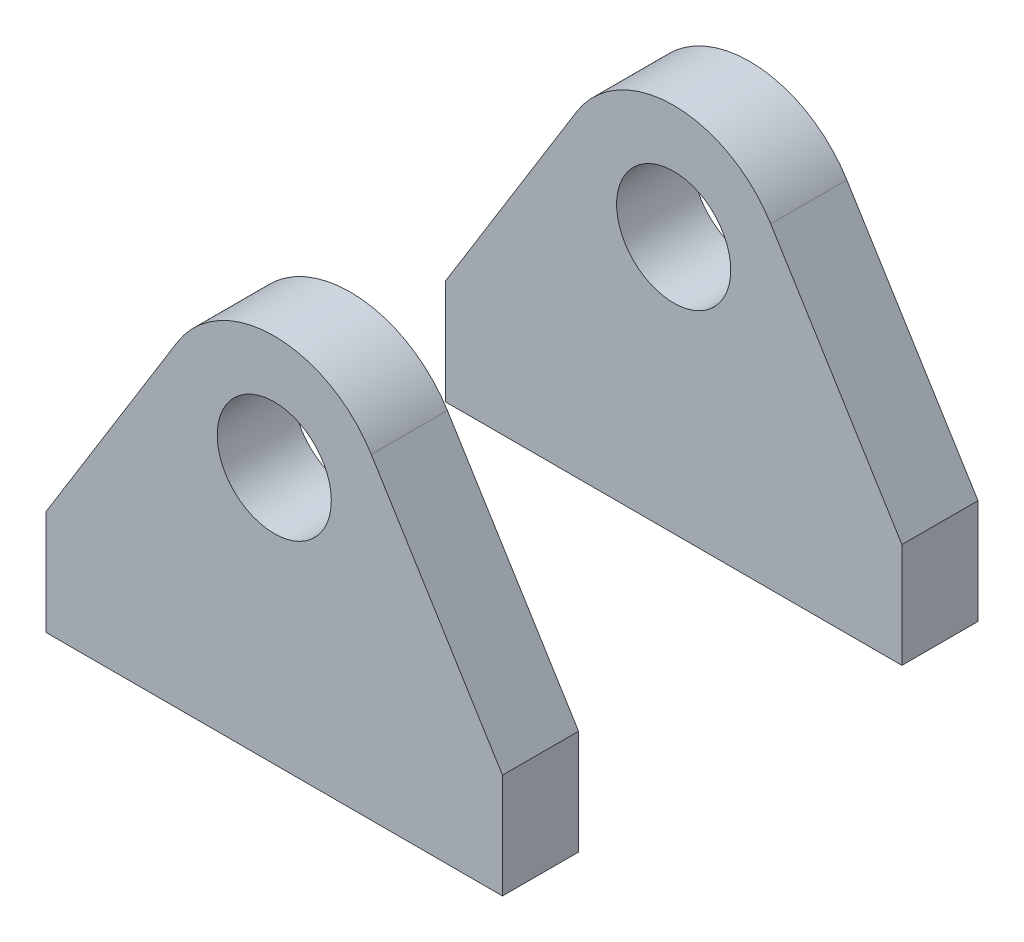
ISO-10303-21;
HEADER;
FILE_DESCRIPTION(('STEP AP214'),'2;1');
FILE_NAME('part.step','',(''),(''),'','','');
FILE_SCHEMA(('AUTOMOTIVE_DESIGN { 1 0 10303 214 1 1 1 1 }'));
ENDSEC;
DATA;
#1=APPLICATION_CONTEXT('core data for automotive mechanical design processes');
#2=APPLICATION_PROTOCOL_DEFINITION('international standard','automotive_design',2000,#1);
#3=PRODUCT_CONTEXT('',#1,'mechanical');
#4=PRODUCT('Part','Part','',(#3));
#5=PRODUCT_RELATED_PRODUCT_CATEGORY('part','',(#4));
#6=PRODUCT_DEFINITION_FORMATION('','',#4);
#7=PRODUCT_DEFINITION_CONTEXT('part definition',#1,'design');
#8=PRODUCT_DEFINITION('design','',#6,#7);
#9=PRODUCT_DEFINITION_SHAPE('','',#8);
#10=(LENGTH_UNIT() NAMED_UNIT(*) SI_UNIT(.MILLI.,.METRE.));
#11=(NAMED_UNIT(*) PLANE_ANGLE_UNIT() SI_UNIT($,.RADIAN.));
#12=(NAMED_UNIT(*) SI_UNIT($,.STERADIAN.) SOLID_ANGLE_UNIT());
#13=UNCERTAINTY_MEASURE_WITH_UNIT(LENGTH_MEASURE(1.E-05),#10,'distance_accuracy_value','');
#14=(GEOMETRIC_REPRESENTATION_CONTEXT(3) GLOBAL_UNCERTAINTY_ASSIGNED_CONTEXT((#13)) GLOBAL_UNIT_ASSIGNED_CONTEXT((#10,
#11,#12)) REPRESENTATION_CONTEXT('',''));
#15=CARTESIAN_POINT('',(0.,0.,0.));
#16=DIRECTION('',(0.,0.,1.));
#17=DIRECTION('',(1.,0.,0.));
#18=AXIS2_PLACEMENT_3D('',#15,#16,#17);
#19=CARTESIAN_POINT('',(0.,15.6461210231856,9.525));
#20=DIRECTION('',(0.,0.,-1.));
#21=DIRECTION('',(-1.,0.,0.));
#22=AXIS2_PLACEMENT_3D('',#19,#20,#21);
#23=CYLINDRICAL_SURFACE('',#22,9.525);
#24=CARTESIAN_POINT('',(0.,15.6461210231856,3.175));
#25=DIRECTION('',(0.,0.,1.));
#26=DIRECTION('',(1.,0.,0.));
#27=AXIS2_PLACEMENT_3D('',#24,#25,#26);
#28=CIRCLE('',#27,9.525);
#29=CARTESIAN_POINT('',(-8.10170014953666,20.6549212474906,3.175));
#30=VERTEX_POINT('',#29);
#31=CARTESIAN_POINT('',(8.10170014953665,20.6549212474906,3.175));
#32=VERTEX_POINT('',#31);
#33=EDGE_CURVE('E169',#30,#32,#28,.F.);
#34=ORIENTED_EDGE('',*,*,#33,.F.);
#35=DIRECTION('',(0.,0.,-1.));
#36=VECTOR('',#35,1.);
#37=CARTESIAN_POINT('',(-8.10170014953666,20.6549212474906,9.525));
#38=LINE('',#37,#36);
#39=CARTESIAN_POINT('',(-8.10170014953666,20.6549212474906,9.525));
#40=VERTEX_POINT('',#39);
#41=EDGE_CURVE('E12',#40,#30,#38,.T.);
#42=ORIENTED_EDGE('',*,*,#41,.F.);
#43=CARTESIAN_POINT('',(0.,15.6461210231856,9.525));
#44=DIRECTION('',(0.,0.,1.));
#45=DIRECTION('',(1.,0.,0.));
#46=AXIS2_PLACEMENT_3D('',#43,#44,#45);
#47=CIRCLE('',#46,9.525);
#48=CARTESIAN_POINT('',(8.10170014953665,20.6549212474906,9.525));
#49=VERTEX_POINT('',#48);
#50=EDGE_CURVE('E286',#40,#49,#47,.F.);
#51=ORIENTED_EDGE('',*,*,#50,.T.);
#52=DIRECTION('',(0.,0.,-1.));
#53=VECTOR('',#52,1.);
#54=CARTESIAN_POINT('',(8.10170014953665,20.6549212474906,9.525));
#55=LINE('',#54,#53);
#56=EDGE_CURVE('E76',#49,#32,#55,.T.);
#57=ORIENTED_EDGE('',*,*,#56,.T.);
#58=EDGE_LOOP('',(#34,#42,#51,#57));
#59=FACE_BOUND('',#58,.T.);
#60=ADVANCED_FACE('F55',(#59),#23,.T.);
#61=CARTESIAN_POINT('',(-13.7821617455123,11.4668134171491,9.525));
#62=DIRECTION('',(-0.850572194177077,0.525858291265615,0.));
#63=DIRECTION('',(-0.525858291265615,-0.850572194177077,0.));
#64=AXIS2_PLACEMENT_3D('',#61,#62,#63);
#65=PLANE('',#64);
#66=DIRECTION('',(0.525858291265615,0.850572194177077,0.));
#67=VECTOR('',#66,1.);
#68=CARTESIAN_POINT('',(-13.7821617455123,11.4668134171491,3.175));
#69=LINE('',#68,#67);
#70=CARTESIAN_POINT('',(-19.05,2.94612102318559,3.175));
#71=VERTEX_POINT('',#70);
#72=EDGE_CURVE('E165',#71,#30,#69,.T.);
#73=ORIENTED_EDGE('',*,*,#72,.F.);
#74=DIRECTION('',(0.,0.,-1.));
#75=VECTOR('',#74,1.);
#76=CARTESIAN_POINT('',(-19.05,2.94612102318559,9.525));
#77=LINE('',#76,#75);
#78=CARTESIAN_POINT('',(-19.05,2.94612102318559,9.525));
#79=VERTEX_POINT('',#78);
#80=EDGE_CURVE('E65',#79,#71,#77,.T.);
#81=ORIENTED_EDGE('',*,*,#80,.F.);
#82=DIRECTION('',(0.525858291265615,0.850572194177077,0.));
#83=VECTOR('',#82,1.);
#84=CARTESIAN_POINT('',(-13.7821617455123,11.4668134171491,9.525));
#85=LINE('',#84,#83);
#86=EDGE_CURVE('E289',#79,#40,#85,.T.);
#87=ORIENTED_EDGE('',*,*,#86,.T.);
#88=ORIENTED_EDGE('',*,*,#41,.T.);
#89=EDGE_LOOP('',(#73,#81,#87,#88));
#90=FACE_BOUND('',#89,.T.);
#91=ADVANCED_FACE('F166',(#90),#65,.T.);
#92=CARTESIAN_POINT('',(-19.05,2.9461210231856,9.525));
#93=DIRECTION('',(-1.,0.,0.));
#94=DIRECTION('',(0.,0.,1.));
#95=AXIS2_PLACEMENT_3D('',#92,#93,#94);
#96=PLANE('',#95);
#97=DIRECTION('',(0.,1.,0.));
#98=VECTOR('',#97,1.);
#99=CARTESIAN_POINT('',(-19.05,2.9461210231856,3.175));
#100=LINE('',#99,#98);
#101=CARTESIAN_POINT('',(-19.05,-5.7851289768144,3.175));
#102=VERTEX_POINT('',#101);
#103=EDGE_CURVE('E161',#102,#71,#100,.T.);
#104=ORIENTED_EDGE('',*,*,#103,.F.);
#105=DIRECTION('',(0.,0.,-1.));
#106=VECTOR('',#105,1.);
#107=CARTESIAN_POINT('',(-19.05,-5.7851289768144,9.525));
#108=LINE('',#107,#106);
#109=CARTESIAN_POINT('',(-19.05,-5.7851289768144,9.525));
#110=VERTEX_POINT('',#109);
#111=EDGE_CURVE('E148',#110,#102,#108,.T.);
#112=ORIENTED_EDGE('',*,*,#111,.F.);
#113=DIRECTION('',(0.,1.,0.));
#114=VECTOR('',#113,1.);
#115=CARTESIAN_POINT('',(-19.05,2.9461210231856,9.525));
#116=LINE('',#115,#114);
#117=EDGE_CURVE('E140',#110,#79,#116,.T.);
#118=ORIENTED_EDGE('',*,*,#117,.T.);
#119=ORIENTED_EDGE('',*,*,#80,.T.);
#120=EDGE_LOOP('',(#104,#112,#118,#119));
#121=FACE_BOUND('',#120,.T.);
#122=ADVANCED_FACE('F159',(#121),#96,.T.);
#123=CARTESIAN_POINT('',(0.,-5.7851289768144,9.525));
#124=DIRECTION('',(0.,1.,0.));
#125=DIRECTION('',(-1.,0.,0.));
#126=AXIS2_PLACEMENT_3D('',#123,#124,#125);
#127=PLANE('',#126);
#128=DIRECTION('',(1.,0.,0.));
#129=VECTOR('',#128,1.);
#130=CARTESIAN_POINT('',(0.,-5.7851289768144,3.175));
#131=LINE('',#130,#129);
#132=CARTESIAN_POINT('',(19.05,-5.7851289768144,3.175));
#133=VERTEX_POINT('',#132);
#134=EDGE_CURVE('E146',#102,#133,#131,.T.);
#135=ORIENTED_EDGE('',*,*,#134,.T.);
#136=DIRECTION('',(0.,0.,-1.));
#137=VECTOR('',#136,1.);
#138=CARTESIAN_POINT('',(19.05,-5.7851289768144,9.525));
#139=LINE('',#138,#137);
#140=CARTESIAN_POINT('',(19.05,-5.7851289768144,9.525));
#141=VERTEX_POINT('',#140);
#142=EDGE_CURVE('E127',#141,#133,#139,.T.);
#143=ORIENTED_EDGE('',*,*,#142,.F.);
#144=DIRECTION('',(1.,0.,0.));
#145=VECTOR('',#144,1.);
#146=CARTESIAN_POINT('',(0.,-5.7851289768144,9.525));
#147=LINE('',#146,#145);
#148=EDGE_CURVE('E133',#110,#141,#147,.T.);
#149=ORIENTED_EDGE('',*,*,#148,.F.);
#150=ORIENTED_EDGE('',*,*,#111,.T.);
#151=EDGE_LOOP('',(#135,#143,#149,#150));
#152=FACE_BOUND('',#151,.T.);
#153=ADVANCED_FACE('F144',(#152),#127,.F.);
#154=CARTESIAN_POINT('',(19.05,2.9461210231856,9.525));
#155=DIRECTION('',(-1.,0.,0.));
#156=DIRECTION('',(0.,0.,1.));
#157=AXIS2_PLACEMENT_3D('',#154,#155,#156);
#158=PLANE('',#157);
#159=DIRECTION('',(0.,1.,0.));
#160=VECTOR('',#159,1.);
#161=CARTESIAN_POINT('',(19.05,2.9461210231856,3.175));
#162=LINE('',#161,#160);
#163=CARTESIAN_POINT('',(19.05,2.9461210231856,3.175));
#164=VERTEX_POINT('',#163);
#165=EDGE_CURVE('E175',#133,#164,#162,.T.);
#166=ORIENTED_EDGE('',*,*,#165,.T.);
#167=DIRECTION('',(0.,0.,-1.));
#168=VECTOR('',#167,1.);
#169=CARTESIAN_POINT('',(19.05,2.9461210231856,9.525));
#170=LINE('',#169,#168);
#171=CARTESIAN_POINT('',(19.05,2.9461210231856,9.525));
#172=VERTEX_POINT('',#171);
#173=EDGE_CURVE('E103',#172,#164,#170,.T.);
#174=ORIENTED_EDGE('',*,*,#173,.F.);
#175=DIRECTION('',(0.,1.,0.));
#176=VECTOR('',#175,1.);
#177=CARTESIAN_POINT('',(19.05,2.9461210231856,9.525));
#178=LINE('',#177,#176);
#179=EDGE_CURVE('E123',#141,#172,#178,.T.);
#180=ORIENTED_EDGE('',*,*,#179,.F.);
#181=ORIENTED_EDGE('',*,*,#142,.T.);
#182=EDGE_LOOP('',(#166,#174,#180,#181));
#183=FACE_BOUND('',#182,.T.);
#184=ADVANCED_FACE('F125',(#183),#158,.F.);
#185=CARTESIAN_POINT('',(0.,15.6461210231856,9.525));
#186=DIRECTION('',(0.,0.,-1.));
#187=DIRECTION('',(-1.,0.,0.));
#188=AXIS2_PLACEMENT_3D('',#185,#186,#187);
#189=CYLINDRICAL_SURFACE('',#188,4.7625);
#190=CARTESIAN_POINT('',(0.,15.6461210231856,9.525));
#191=DIRECTION('',(0.,0.,1.));
#192=DIRECTION('',(1.,0.,0.));
#193=AXIS2_PLACEMENT_3D('',#190,#191,#192);
#194=CIRCLE('',#193,4.7625);
#195=CARTESIAN_POINT('',(4.7625,15.6461210231856,9.525));
#196=VERTEX_POINT('',#195);
#197=EDGE_CURVE('E184',#196,#196,#194,.T.);
#198=ORIENTED_EDGE('',*,*,#197,.T.);
#199=EDGE_LOOP('',(#198));
#200=FACE_BOUND('',#199,.T.);
#201=CARTESIAN_POINT('',(0.,15.6461210231856,3.175));
#202=DIRECTION('',(0.,0.,1.));
#203=DIRECTION('',(1.,0.,0.));
#204=AXIS2_PLACEMENT_3D('',#201,#202,#203);
#205=CIRCLE('',#204,4.7625);
#206=CARTESIAN_POINT('',(4.7625,15.6461210231856,3.175));
#207=VERTEX_POINT('',#206);
#208=EDGE_CURVE('E189',#207,#207,#205,.T.);
#209=ORIENTED_EDGE('',*,*,#208,.F.);
#210=EDGE_LOOP('',(#209));
#211=FACE_BOUND('',#210,.T.);
#212=ADVANCED_FACE('F57',(#200,#211),#189,.F.);
#213=CARTESIAN_POINT('',(13.7821617455123,11.4668134171491,9.525));
#214=DIRECTION('',(0.850572194177077,0.525858291265616,0.));
#215=DIRECTION('',(-0.525858291265616,0.850572194177077,0.));
#216=AXIS2_PLACEMENT_3D('',#213,#214,#215);
#217=PLANE('',#216);
#218=DIRECTION('',(0.525858291265616,-0.850572194177077,0.));
#219=VECTOR('',#218,1.);
#220=CARTESIAN_POINT('',(13.7821617455123,11.4668134171491,3.175));
#221=LINE('',#220,#219);
#222=EDGE_CURVE('E181',#32,#164,#221,.T.);
#223=ORIENTED_EDGE('',*,*,#222,.F.);
#224=ORIENTED_EDGE('',*,*,#56,.F.);
#225=DIRECTION('',(0.525858291265616,-0.850572194177077,0.));
#226=VECTOR('',#225,1.);
#227=CARTESIAN_POINT('',(13.7821617455123,11.4668134171491,9.525));
#228=LINE('',#227,#226);
#229=EDGE_CURVE('E132',#49,#172,#228,.T.);
#230=ORIENTED_EDGE('',*,*,#229,.T.);
#231=ORIENTED_EDGE('',*,*,#173,.T.);
#232=EDGE_LOOP('',(#223,#224,#230,#231));
#233=FACE_BOUND('',#232,.T.);
#234=ADVANCED_FACE('F193',(#233),#217,.T.);
#235=CARTESIAN_POINT('',(0.,2.9461210231856,9.525));
#236=DIRECTION('',(0.,0.,1.));
#237=DIRECTION('',(1.,0.,0.));
#238=AXIS2_PLACEMENT_3D('',#235,#236,#237);
#239=PLANE('',#238);
#240=ORIENTED_EDGE('',*,*,#197,.F.);
#241=EDGE_LOOP('',(#240));
#242=FACE_BOUND('',#241,.T.);
#243=ORIENTED_EDGE('',*,*,#50,.F.);
#244=ORIENTED_EDGE('',*,*,#86,.F.);
#245=ORIENTED_EDGE('',*,*,#117,.F.);
#246=ORIENTED_EDGE('',*,*,#148,.T.);
#247=ORIENTED_EDGE('',*,*,#179,.T.);
#248=ORIENTED_EDGE('',*,*,#229,.F.);
#249=EDGE_LOOP('',(#243,#244,#245,#246,#247,#248));
#250=FACE_BOUND('',#249,.T.);
#251=ADVANCED_FACE('F137',(#242,#250),#239,.T.);
#252=CARTESIAN_POINT('',(0.,2.9461210231856,3.175));
#253=DIRECTION('',(0.,0.,1.));
#254=DIRECTION('',(1.,0.,0.));
#255=AXIS2_PLACEMENT_3D('',#252,#253,#254);
#256=PLANE('',#255);
#257=ORIENTED_EDGE('',*,*,#208,.T.);
#258=EDGE_LOOP('',(#257));
#259=FACE_BOUND('',#258,.T.);
#260=ORIENTED_EDGE('',*,*,#33,.T.);
#261=ORIENTED_EDGE('',*,*,#222,.T.);
#262=ORIENTED_EDGE('',*,*,#165,.F.);
#263=ORIENTED_EDGE('',*,*,#134,.F.);
#264=ORIENTED_EDGE('',*,*,#103,.T.);
#265=ORIENTED_EDGE('',*,*,#72,.T.);
#266=EDGE_LOOP('',(#260,#261,#262,#263,#264,#265));
#267=FACE_BOUND('',#266,.T.);
#268=ADVANCED_FACE('F171',(#259,#267),#256,.F.);
#269=CLOSED_SHELL('',(#60,#91,#122,#153,#184,#212,#234,#251,#268));
#270=MANIFOLD_SOLID_BREP('B2',#269);
#271=CARTESIAN_POINT('',(0.,15.6461210231856,-23.8125));
#272=DIRECTION('',(0.,0.,-1.));
#273=DIRECTION('',(-1.,0.,0.));
#274=AXIS2_PLACEMENT_3D('',#271,#272,#273);
#275=CYLINDRICAL_SURFACE('',#274,9.525);
#276=CARTESIAN_POINT('',(0.,15.6461210231856,-30.1625));
#277=DIRECTION('',(0.,0.,1.));
#278=DIRECTION('',(1.,0.,0.));
#279=AXIS2_PLACEMENT_3D('',#276,#277,#278);
#280=CIRCLE('',#279,9.525);
#281=CARTESIAN_POINT('',(-8.10170014953666,20.6549212474906,-30.1625));
#282=VERTEX_POINT('',#281);
#283=CARTESIAN_POINT('',(8.10170014953665,20.6549212474906,-30.1625));
#284=VERTEX_POINT('',#283);
#285=EDGE_CURVE('E415',#282,#284,#280,.F.);
#286=ORIENTED_EDGE('',*,*,#285,.F.);
#287=DIRECTION('',(0.,0.,-1.));
#288=VECTOR('',#287,1.);
#289=CARTESIAN_POINT('',(-8.10170014953666,20.6549212474906,-23.8125));
#290=LINE('',#289,#288);
#291=CARTESIAN_POINT('',(-8.10170014953666,20.6549212474906,-23.8125));
#292=VERTEX_POINT('',#291);
#293=EDGE_CURVE('E53',#292,#282,#290,.T.);
#294=ORIENTED_EDGE('',*,*,#293,.F.);
#295=CARTESIAN_POINT('',(0.,15.6461210231856,-23.8125));
#296=DIRECTION('',(0.,0.,1.));
#297=DIRECTION('',(1.,0.,0.));
#298=AXIS2_PLACEMENT_3D('',#295,#296,#297);
#299=CIRCLE('',#298,9.525);
#300=CARTESIAN_POINT('',(8.10170014953665,20.6549212474906,-23.8125));
#301=VERTEX_POINT('',#300);
#302=EDGE_CURVE('E530',#292,#301,#299,.F.);
#303=ORIENTED_EDGE('',*,*,#302,.T.);
#304=DIRECTION('',(0.,0.,-1.));
#305=VECTOR('',#304,1.);
#306=CARTESIAN_POINT('',(8.10170014953665,20.6549212474906,-23.8125));
#307=LINE('',#306,#305);
#308=EDGE_CURVE('E319',#301,#284,#307,.T.);
#309=ORIENTED_EDGE('',*,*,#308,.T.);
#310=EDGE_LOOP('',(#286,#294,#303,#309));
#311=FACE_BOUND('',#310,.T.);
#312=ADVANCED_FACE('F298',(#311),#275,.T.);
#313=CARTESIAN_POINT('',(-13.7821617455123,11.4668134171491,-23.8125));
#314=DIRECTION('',(-0.850572194177077,0.525858291265615,0.));
#315=DIRECTION('',(-0.525858291265615,-0.850572194177077,0.));
#316=AXIS2_PLACEMENT_3D('',#313,#314,#315);
#317=PLANE('',#316);
#318=DIRECTION('',(0.525858291265615,0.850572194177077,0.));
#319=VECTOR('',#318,1.);
#320=CARTESIAN_POINT('',(-13.7821617455123,11.4668134171491,-30.1625));
#321=LINE('',#320,#319);
#322=CARTESIAN_POINT('',(-19.05,2.94612102318559,-30.1625));
#323=VERTEX_POINT('',#322);
#324=EDGE_CURVE('E411',#323,#282,#321,.T.);
#325=ORIENTED_EDGE('',*,*,#324,.F.);
#326=DIRECTION('',(0.,0.,-1.));
#327=VECTOR('',#326,1.);
#328=CARTESIAN_POINT('',(-19.05,2.94612102318559,-23.8125));
#329=LINE('',#328,#327);
#330=CARTESIAN_POINT('',(-19.05,2.94612102318559,-23.8125));
#331=VERTEX_POINT('',#330);
#332=EDGE_CURVE('E308',#331,#323,#329,.T.);
#333=ORIENTED_EDGE('',*,*,#332,.F.);
#334=DIRECTION('',(0.525858291265615,0.850572194177077,0.));
#335=VECTOR('',#334,1.);
#336=CARTESIAN_POINT('',(-13.7821617455123,11.4668134171491,-23.8125));
#337=LINE('',#336,#335);
#338=EDGE_CURVE('E533',#331,#292,#337,.T.);
#339=ORIENTED_EDGE('',*,*,#338,.T.);
#340=ORIENTED_EDGE('',*,*,#293,.T.);
#341=EDGE_LOOP('',(#325,#333,#339,#340));
#342=FACE_BOUND('',#341,.T.);
#343=ADVANCED_FACE('F412',(#342),#317,.T.);
#344=CARTESIAN_POINT('',(-19.05,2.9461210231856,-23.8125));
#345=DIRECTION('',(-1.,0.,0.));
#346=DIRECTION('',(0.,0.,1.));
#347=AXIS2_PLACEMENT_3D('',#344,#345,#346);
#348=PLANE('',#347);
#349=DIRECTION('',(0.,1.,0.));
#350=VECTOR('',#349,1.);
#351=CARTESIAN_POINT('',(-19.05,2.9461210231856,-30.1625));
#352=LINE('',#351,#350);
#353=CARTESIAN_POINT('',(-19.05,-5.7851289768144,-30.1625));
#354=VERTEX_POINT('',#353);
#355=EDGE_CURVE('E407',#354,#323,#352,.T.);
#356=ORIENTED_EDGE('',*,*,#355,.F.);
#357=DIRECTION('',(0.,0.,-1.));
#358=VECTOR('',#357,1.);
#359=CARTESIAN_POINT('',(-19.05,-5.7851289768144,-23.8125));
#360=LINE('',#359,#358);
#361=CARTESIAN_POINT('',(-19.05,-5.7851289768144,-23.8125));
#362=VERTEX_POINT('',#361);
#363=EDGE_CURVE('E391',#362,#354,#360,.T.);
#364=ORIENTED_EDGE('',*,*,#363,.F.);
#365=DIRECTION('',(0.,1.,0.));
#366=VECTOR('',#365,1.);
#367=CARTESIAN_POINT('',(-19.05,2.9461210231856,-23.8125));
#368=LINE('',#367,#366);
#369=EDGE_CURVE('E383',#362,#331,#368,.T.);
#370=ORIENTED_EDGE('',*,*,#369,.T.);
#371=ORIENTED_EDGE('',*,*,#332,.T.);
#372=EDGE_LOOP('',(#356,#364,#370,#371));
#373=FACE_BOUND('',#372,.T.);
#374=ADVANCED_FACE('F405',(#373),#348,.T.);
#375=CARTESIAN_POINT('',(0.,-5.7851289768144,-23.8125));
#376=DIRECTION('',(0.,1.,0.));
#377=DIRECTION('',(-1.,0.,0.));
#378=AXIS2_PLACEMENT_3D('',#375,#376,#377);
#379=PLANE('',#378);
#380=DIRECTION('',(1.,0.,0.));
#381=VECTOR('',#380,1.);
#382=CARTESIAN_POINT('',(0.,-5.7851289768144,-30.1625));
#383=LINE('',#382,#381);
#384=CARTESIAN_POINT('',(19.05,-5.7851289768144,-30.1625));
#385=VERTEX_POINT('',#384);
#386=EDGE_CURVE('E389',#354,#385,#383,.T.);
#387=ORIENTED_EDGE('',*,*,#386,.T.);
#388=DIRECTION('',(0.,0.,-1.));
#389=VECTOR('',#388,1.);
#390=CARTESIAN_POINT('',(19.05,-5.7851289768144,-23.8125));
#391=LINE('',#390,#389);
#392=CARTESIAN_POINT('',(19.05,-5.7851289768144,-23.8125));
#393=VERTEX_POINT('',#392);
#394=EDGE_CURVE('E370',#393,#385,#391,.T.);
#395=ORIENTED_EDGE('',*,*,#394,.F.);
#396=DIRECTION('',(1.,0.,0.));
#397=VECTOR('',#396,1.);
#398=CARTESIAN_POINT('',(0.,-5.7851289768144,-23.8125));
#399=LINE('',#398,#397);
#400=EDGE_CURVE('E376',#362,#393,#399,.T.);
#401=ORIENTED_EDGE('',*,*,#400,.F.);
#402=ORIENTED_EDGE('',*,*,#363,.T.);
#403=EDGE_LOOP('',(#387,#395,#401,#402));
#404=FACE_BOUND('',#403,.T.);
#405=ADVANCED_FACE('F387',(#404),#379,.F.);
#406=CARTESIAN_POINT('',(19.05,2.9461210231856,-23.8125));
#407=DIRECTION('',(-1.,0.,0.));
#408=DIRECTION('',(0.,0.,1.));
#409=AXIS2_PLACEMENT_3D('',#406,#407,#408);
#410=PLANE('',#409);
#411=DIRECTION('',(0.,1.,0.));
#412=VECTOR('',#411,1.);
#413=CARTESIAN_POINT('',(19.05,2.9461210231856,-30.1625));
#414=LINE('',#413,#412);
#415=CARTESIAN_POINT('',(19.05,2.9461210231856,-30.1625));
#416=VERTEX_POINT('',#415);
#417=EDGE_CURVE('E420',#385,#416,#414,.T.);
#418=ORIENTED_EDGE('',*,*,#417,.T.);
#419=DIRECTION('',(0.,0.,-1.));
#420=VECTOR('',#419,1.);
#421=CARTESIAN_POINT('',(19.05,2.9461210231856,-23.8125));
#422=LINE('',#421,#420);
#423=CARTESIAN_POINT('',(19.05,2.9461210231856,-23.8125));
#424=VERTEX_POINT('',#423);
#425=EDGE_CURVE('E344',#424,#416,#422,.T.);
#426=ORIENTED_EDGE('',*,*,#425,.F.);
#427=DIRECTION('',(0.,1.,0.));
#428=VECTOR('',#427,1.);
#429=CARTESIAN_POINT('',(19.05,2.9461210231856,-23.8125));
#430=LINE('',#429,#428);
#431=EDGE_CURVE('E366',#393,#424,#430,.T.);
#432=ORIENTED_EDGE('',*,*,#431,.F.);
#433=ORIENTED_EDGE('',*,*,#394,.T.);
#434=EDGE_LOOP('',(#418,#426,#432,#433));
#435=FACE_BOUND('',#434,.T.);
#436=ADVANCED_FACE('F368',(#435),#410,.F.);
#437=CARTESIAN_POINT('',(0.,15.6461210231856,-23.8125));
#438=DIRECTION('',(0.,0.,-1.));
#439=DIRECTION('',(-1.,0.,0.));
#440=AXIS2_PLACEMENT_3D('',#437,#438,#439);
#441=CYLINDRICAL_SURFACE('',#440,4.7625);
#442=CARTESIAN_POINT('',(0.,15.6461210231856,-23.8125));
#443=DIRECTION('',(0.,0.,1.));
#444=DIRECTION('',(1.,0.,0.));
#445=AXIS2_PLACEMENT_3D('',#442,#443,#444);
#446=CIRCLE('',#445,4.7625);
#447=CARTESIAN_POINT('',(4.7625,15.6461210231856,-23.8125));
#448=VERTEX_POINT('',#447);
#449=EDGE_CURVE('E429',#448,#448,#446,.T.);
#450=ORIENTED_EDGE('',*,*,#449,.T.);
#451=EDGE_LOOP('',(#450));
#452=FACE_BOUND('',#451,.T.);
#453=CARTESIAN_POINT('',(0.,15.6461210231856,-30.1625));
#454=DIRECTION('',(0.,0.,1.));
#455=DIRECTION('',(1.,0.,0.));
#456=AXIS2_PLACEMENT_3D('',#453,#454,#455);
#457=CIRCLE('',#456,4.7625);
#458=CARTESIAN_POINT('',(4.7625,15.6461210231856,-30.1625));
#459=VERTEX_POINT('',#458);
#460=EDGE_CURVE('E434',#459,#459,#457,.T.);
#461=ORIENTED_EDGE('',*,*,#460,.F.);
#462=EDGE_LOOP('',(#461));
#463=FACE_BOUND('',#462,.T.);
#464=ADVANCED_FACE('F300',(#452,#463),#441,.F.);
#465=CARTESIAN_POINT('',(13.7821617455123,11.4668134171491,-23.8125));
#466=DIRECTION('',(0.850572194177077,0.525858291265616,0.));
#467=DIRECTION('',(-0.525858291265616,0.850572194177077,0.));
#468=AXIS2_PLACEMENT_3D('',#465,#466,#467);
#469=PLANE('',#468);
#470=DIRECTION('',(0.525858291265616,-0.850572194177077,0.));
#471=VECTOR('',#470,1.);
#472=CARTESIAN_POINT('',(13.7821617455123,11.4668134171491,-30.1625));
#473=LINE('',#472,#471);
#474=EDGE_CURVE('E426',#284,#416,#473,.T.);
#475=ORIENTED_EDGE('',*,*,#474,.F.);
#476=ORIENTED_EDGE('',*,*,#308,.F.);
#477=DIRECTION('',(0.525858291265616,-0.850572194177077,0.));
#478=VECTOR('',#477,1.);
#479=CARTESIAN_POINT('',(13.7821617455123,11.4668134171491,-23.8125));
#480=LINE('',#479,#478);
#481=EDGE_CURVE('E375',#301,#424,#480,.T.);
#482=ORIENTED_EDGE('',*,*,#481,.T.);
#483=ORIENTED_EDGE('',*,*,#425,.T.);
#484=EDGE_LOOP('',(#475,#476,#482,#483));
#485=FACE_BOUND('',#484,.T.);
#486=ADVANCED_FACE('F438',(#485),#469,.T.);
#487=CARTESIAN_POINT('',(0.,2.9461210231856,-23.8125));
#488=DIRECTION('',(0.,0.,1.));
#489=DIRECTION('',(1.,0.,0.));
#490=AXIS2_PLACEMENT_3D('',#487,#488,#489);
#491=PLANE('',#490);
#492=ORIENTED_EDGE('',*,*,#449,.F.);
#493=EDGE_LOOP('',(#492));
#494=FACE_BOUND('',#493,.T.);
#495=ORIENTED_EDGE('',*,*,#302,.F.);
#496=ORIENTED_EDGE('',*,*,#338,.F.);
#497=ORIENTED_EDGE('',*,*,#369,.F.);
#498=ORIENTED_EDGE('',*,*,#400,.T.);
#499=ORIENTED_EDGE('',*,*,#431,.T.);
#500=ORIENTED_EDGE('',*,*,#481,.F.);
#501=EDGE_LOOP('',(#495,#496,#497,#498,#499,#500));
#502=FACE_BOUND('',#501,.T.);
#503=ADVANCED_FACE('F380',(#494,#502),#491,.T.);
#504=CARTESIAN_POINT('',(0.,2.9461210231856,-30.1625));
#505=DIRECTION('',(0.,0.,1.));
#506=DIRECTION('',(1.,0.,0.));
#507=AXIS2_PLACEMENT_3D('',#504,#505,#506);
#508=PLANE('',#507);
#509=ORIENTED_EDGE('',*,*,#460,.T.);
#510=EDGE_LOOP('',(#509));
#511=FACE_BOUND('',#510,.T.);
#512=ORIENTED_EDGE('',*,*,#285,.T.);
#513=ORIENTED_EDGE('',*,*,#474,.T.);
#514=ORIENTED_EDGE('',*,*,#417,.F.);
#515=ORIENTED_EDGE('',*,*,#386,.F.);
#516=ORIENTED_EDGE('',*,*,#355,.T.);
#517=ORIENTED_EDGE('',*,*,#324,.T.);
#518=EDGE_LOOP('',(#512,#513,#514,#515,#516,#517));
#519=FACE_BOUND('',#518,.T.);
#520=ADVANCED_FACE('F417',(#511,#519),#508,.F.);
#521=CLOSED_SHELL('',(#312,#343,#374,#405,#436,#464,#486,#503,#520));
#522=MANIFOLD_SOLID_BREP('B6',#521);
#523=ADVANCED_BREP_SHAPE_REPRESENTATION('',(#18,#270,#522),#14);
#524=SHAPE_DEFINITION_REPRESENTATION(#9,#523);
ENDSEC;
END-ISO-10303-21;
